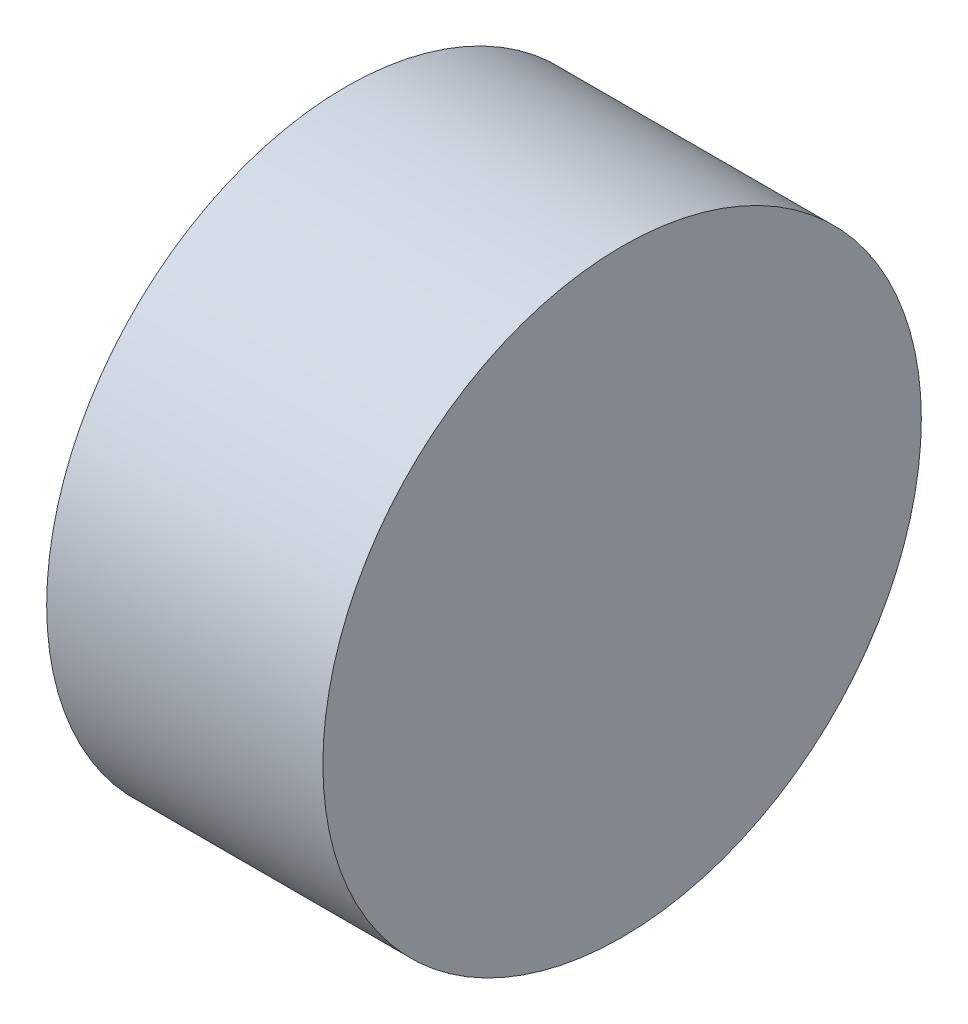
ISO-10303-21;
HEADER;
FILE_DESCRIPTION(('STEP AP214'),'2;1');
FILE_NAME('part.step','',(''),(''),'','','');
FILE_SCHEMA(('AUTOMOTIVE_DESIGN { 1 0 10303 214 1 1 1 1 }'));
ENDSEC;
DATA;
#1=APPLICATION_CONTEXT('core data for automotive mechanical design processes');
#2=APPLICATION_PROTOCOL_DEFINITION('international standard','automotive_design',2000,#1);
#3=PRODUCT_CONTEXT('',#1,'mechanical');
#4=PRODUCT('Part','Part','',(#3));
#5=PRODUCT_RELATED_PRODUCT_CATEGORY('part','',(#4));
#6=PRODUCT_DEFINITION_FORMATION('','',#4);
#7=PRODUCT_DEFINITION_CONTEXT('part definition',#1,'design');
#8=PRODUCT_DEFINITION('design','',#6,#7);
#9=PRODUCT_DEFINITION_SHAPE('','',#8);
#10=(LENGTH_UNIT() NAMED_UNIT(*) SI_UNIT(.MILLI.,.METRE.));
#11=(NAMED_UNIT(*) PLANE_ANGLE_UNIT() SI_UNIT($,.RADIAN.));
#12=(NAMED_UNIT(*) SI_UNIT($,.STERADIAN.) SOLID_ANGLE_UNIT());
#13=UNCERTAINTY_MEASURE_WITH_UNIT(LENGTH_MEASURE(1.E-05),#10,'distance_accuracy_value','');
#14=(GEOMETRIC_REPRESENTATION_CONTEXT(3) GLOBAL_UNCERTAINTY_ASSIGNED_CONTEXT((#13)) GLOBAL_UNIT_ASSIGNED_CONTEXT((#10,
#11,#12)) REPRESENTATION_CONTEXT('',''));
#15=CARTESIAN_POINT('',(0.,0.,0.));
#16=DIRECTION('',(0.,0.,1.));
#17=DIRECTION('',(1.,0.,0.));
#18=AXIS2_PLACEMENT_3D('',#15,#16,#17);
#19=CARTESIAN_POINT('',(9.525,0.,0.));
#20=DIRECTION('',(-1.,0.,0.));
#21=DIRECTION('',(0.,0.,1.));
#22=AXIS2_PLACEMENT_3D('',#19,#20,#21);
#23=CYLINDRICAL_SURFACE('',#22,20.6375);
#24=CARTESIAN_POINT('',(9.525,0.,0.));
#25=DIRECTION('',(1.,0.,0.));
#26=DIRECTION('',(0.,0.,-1.));
#27=AXIS2_PLACEMENT_3D('',#24,#25,#26);
#28=CIRCLE('',#27,20.6375);
#29=CARTESIAN_POINT('',(9.525,0.,20.6375));
#30=VERTEX_POINT('',#29);
#31=EDGE_CURVE('E10',#30,#30,#28,.T.);
#32=CARTESIAN_POINT('',(-9.525,0.,0.));
#33=DIRECTION('',(1.,0.,0.));
#34=DIRECTION('',(0.,0.,-1.));
#35=AXIS2_PLACEMENT_3D('',#32,#33,#34);
#36=CIRCLE('',#35,20.6375);
#37=CARTESIAN_POINT('',(-9.525,0.,20.6375));
#38=VERTEX_POINT('',#37);
#39=EDGE_CURVE('E39',#38,#38,#36,.T.);
#40=CARTESIAN_POINT('',(9.525,0.,20.6375));
#41=CARTESIAN_POINT('',(9.3265625,0.,20.6375));
#42=CARTESIAN_POINT('',(9.128125,0.,20.6375));
#43=CARTESIAN_POINT('',(8.73125,0.,20.6375));
#44=CARTESIAN_POINT('',(8.5328125,0.,20.6375));
#45=CARTESIAN_POINT('',(8.1359375,0.,20.6375));
#46=CARTESIAN_POINT('',(7.9375,0.,20.6375));
#47=CARTESIAN_POINT('',(7.540625,0.,20.6375));
#48=CARTESIAN_POINT('',(7.3421875,0.,20.6375));
#49=CARTESIAN_POINT('',(6.9453125,0.,20.6375));
#50=CARTESIAN_POINT('',(6.746875,0.,20.6375));
#51=CARTESIAN_POINT('',(6.35,0.,20.6375));
#52=CARTESIAN_POINT('',(6.1515625,0.,20.6375));
#53=CARTESIAN_POINT('',(5.7546875,0.,20.6375));
#54=CARTESIAN_POINT('',(5.55625,0.,20.6375));
#55=CARTESIAN_POINT('',(5.159375,0.,20.6375));
#56=CARTESIAN_POINT('',(4.9609375,0.,20.6375));
#57=CARTESIAN_POINT('',(4.5640625,0.,20.6375));
#58=CARTESIAN_POINT('',(4.365625,0.,20.6375));
#59=CARTESIAN_POINT('',(3.96875,0.,20.6375));
#60=CARTESIAN_POINT('',(3.7703125,0.,20.6375));
#61=CARTESIAN_POINT('',(3.3734375,0.,20.6375));
#62=CARTESIAN_POINT('',(3.175,0.,20.6375));
#63=CARTESIAN_POINT('',(2.778125,0.,20.6375));
#64=CARTESIAN_POINT('',(2.5796875,0.,20.6375));
#65=CARTESIAN_POINT('',(2.1828125,0.,20.6375));
#66=CARTESIAN_POINT('',(1.984375,0.,20.6375));
#67=CARTESIAN_POINT('',(1.5875,0.,20.6375));
#68=CARTESIAN_POINT('',(1.3890625,0.,20.6375));
#69=CARTESIAN_POINT('',(0.992187500000001,0.,20.6375));
#70=CARTESIAN_POINT('',(0.793750000000001,0.,20.6375));
#71=CARTESIAN_POINT('',(0.396875,0.,20.6375));
#72=CARTESIAN_POINT('',(0.1984375,0.,20.6375));
#73=CARTESIAN_POINT('',(-0.1984375,0.,20.6375));
#74=CARTESIAN_POINT('',(-0.396875,0.,20.6375));
#75=CARTESIAN_POINT('',(-0.793750000000001,0.,20.6375));
#76=CARTESIAN_POINT('',(-0.992187500000001,0.,20.6375));
#77=CARTESIAN_POINT('',(-1.3890625,0.,20.6375));
#78=CARTESIAN_POINT('',(-1.5875,0.,20.6375));
#79=CARTESIAN_POINT('',(-1.984375,0.,20.6375));
#80=CARTESIAN_POINT('',(-2.1828125,0.,20.6375));
#81=CARTESIAN_POINT('',(-2.5796875,0.,20.6375));
#82=CARTESIAN_POINT('',(-2.778125,0.,20.6375));
#83=CARTESIAN_POINT('',(-3.175,0.,20.6375));
#84=CARTESIAN_POINT('',(-3.3734375,0.,20.6375));
#85=CARTESIAN_POINT('',(-3.7703125,0.,20.6375));
#86=CARTESIAN_POINT('',(-3.96875,0.,20.6375));
#87=CARTESIAN_POINT('',(-4.365625,0.,20.6375));
#88=CARTESIAN_POINT('',(-4.5640625,0.,20.6375));
#89=CARTESIAN_POINT('',(-4.9609375,0.,20.6375));
#90=CARTESIAN_POINT('',(-5.159375,0.,20.6375));
#91=CARTESIAN_POINT('',(-5.55625,0.,20.6375));
#92=CARTESIAN_POINT('',(-5.7546875,0.,20.6375));
#93=CARTESIAN_POINT('',(-6.1515625,0.,20.6375));
#94=CARTESIAN_POINT('',(-6.35,0.,20.6375));
#95=CARTESIAN_POINT('',(-6.746875,0.,20.6375));
#96=CARTESIAN_POINT('',(-6.9453125,0.,20.6375));
#97=CARTESIAN_POINT('',(-7.3421875,0.,20.6375));
#98=CARTESIAN_POINT('',(-7.540625,0.,20.6375));
#99=CARTESIAN_POINT('',(-7.9375,0.,20.6375));
#100=CARTESIAN_POINT('',(-8.1359375,0.,20.6375));
#101=CARTESIAN_POINT('',(-8.5328125,0.,20.6375));
#102=CARTESIAN_POINT('',(-8.73125,0.,20.6375));
#103=CARTESIAN_POINT('',(-9.128125,0.,20.6375));
#104=CARTESIAN_POINT('',(-9.3265625,0.,20.6375));
#105=CARTESIAN_POINT('',(-9.525,0.,20.6375));
#106=B_SPLINE_CURVE_WITH_KNOTS('',3,(#40,#41,#42,#43,#44,#45,#46,#47,#48,#49,#50,#51,#52,#53,
#54,#55,#56,#57,#58,#59,#60,#61,#62,#63,#64,#65,#66,#67,#68,#69,#70,#71,#72,#73,#74,#75,#76,#77,
#78,#79,#80,#81,#82,#83,#84,#85,#86,#87,#88,#89,#90,#91,#92,#93,#94,#95,#96,#97,#98,#99,#100,
#101,#102,#103,#104,#105),.UNSPECIFIED.,.F.,.F.,(4,2,2,2,2,2,2,2,2,2,2,2,2,2,2,2,2,2,2,2,2,2,2,
2,2,2,2,2,2,2,2,2,4),(0.,0.5953125,1.190625,1.7859375,2.38125,2.9765625,3.571875,4.1671875,
4.7625,5.3578125,5.953125,6.5484375,7.14375,7.7390625,8.334375,8.9296875,9.525,10.1203125,
10.715625,11.3109375,11.90625,12.5015625,13.096875,13.6921875,14.2875,14.8828125,15.478125,
16.0734375,16.66875,17.2640625,17.859375,18.4546875,19.05),.UNSPECIFIED.);
#107=EDGE_CURVE('BSEAM36',#30,#38,#106,.T.);
#108=ORIENTED_EDGE('',*,*,#31,.F.);
#109=ORIENTED_EDGE('',*,*,#39,.T.);
#110=ORIENTED_EDGE('',*,*,#107,.T.);
#111=ORIENTED_EDGE('',*,*,#107,.F.);
#112=EDGE_LOOP('',(#108,#110,#109,#111));
#113=FACE_BOUND('',#112,.T.);
#114=ADVANCED_FACE('F36',(#113),#23,.T.);
#115=CARTESIAN_POINT('',(9.525,0.,0.));
#116=DIRECTION('',(1.,0.,0.));
#117=DIRECTION('',(0.,0.,-1.));
#118=AXIS2_PLACEMENT_3D('',#115,#116,#117);
#119=PLANE('',#118);
#120=ORIENTED_EDGE('',*,*,#31,.T.);
#121=EDGE_LOOP('',(#120));
#122=FACE_BOUND('',#121,.T.);
#123=ADVANCED_FACE('F51',(#122),#119,.T.);
#124=CARTESIAN_POINT('',(-9.525,0.,0.));
#125=DIRECTION('',(1.,0.,0.));
#126=DIRECTION('',(0.,0.,-1.));
#127=AXIS2_PLACEMENT_3D('',#124,#125,#126);
#128=PLANE('',#127);
#129=ORIENTED_EDGE('',*,*,#39,.F.);
#130=EDGE_LOOP('',(#129));
#131=FACE_BOUND('',#130,.T.);
#132=ADVANCED_FACE('F49',(#131),#128,.F.);
#133=CLOSED_SHELL('',(#114,#123,#132));
#134=MANIFOLD_SOLID_BREP('B2',#133);
#135=ADVANCED_BREP_SHAPE_REPRESENTATION('',(#18,#134),#14);
#136=SHAPE_DEFINITION_REPRESENTATION(#9,#135);
ENDSEC;
END-ISO-10303-21;
